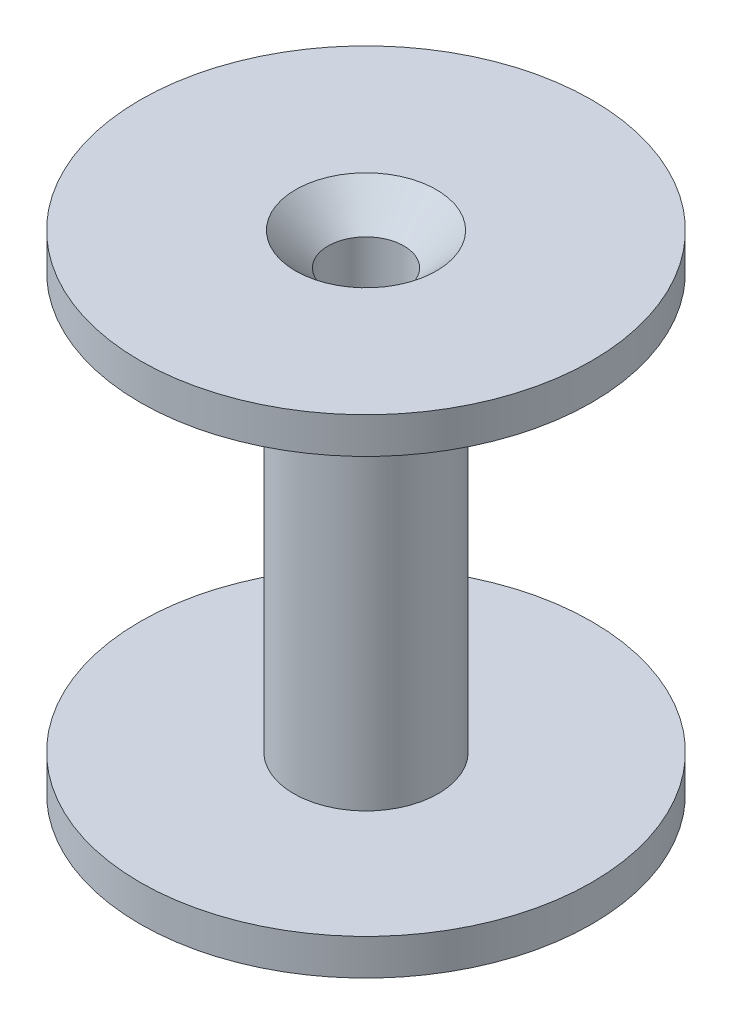
ISO-10303-21;
HEADER;
FILE_DESCRIPTION(('STEP AP214'),'2;1');
FILE_NAME('part.step','',(''),(''),'','','');
FILE_SCHEMA(('AUTOMOTIVE_DESIGN { 1 0 10303 214 1 1 1 1 }'));
ENDSEC;
DATA;
#1=APPLICATION_CONTEXT('core data for automotive mechanical design processes');
#2=APPLICATION_PROTOCOL_DEFINITION('international standard','automotive_design',2000,#1);
#3=PRODUCT_CONTEXT('',#1,'mechanical');
#4=PRODUCT('Part','Part','',(#3));
#5=PRODUCT_RELATED_PRODUCT_CATEGORY('part','',(#4));
#6=PRODUCT_DEFINITION_FORMATION('','',#4);
#7=PRODUCT_DEFINITION_CONTEXT('part definition',#1,'design');
#8=PRODUCT_DEFINITION('design','',#6,#7);
#9=PRODUCT_DEFINITION_SHAPE('','',#8);
#10=(LENGTH_UNIT() NAMED_UNIT(*) SI_UNIT(.MILLI.,.METRE.));
#11=(NAMED_UNIT(*) PLANE_ANGLE_UNIT() SI_UNIT($,.RADIAN.));
#12=(NAMED_UNIT(*) SI_UNIT($,.STERADIAN.) SOLID_ANGLE_UNIT());
#13=UNCERTAINTY_MEASURE_WITH_UNIT(LENGTH_MEASURE(1.E-05),#10,'distance_accuracy_value','');
#14=(GEOMETRIC_REPRESENTATION_CONTEXT(3) GLOBAL_UNCERTAINTY_ASSIGNED_CONTEXT((#13)) GLOBAL_UNIT_ASSIGNED_CONTEXT((#10,
#11,#12)) REPRESENTATION_CONTEXT('',''));
#15=CARTESIAN_POINT('',(0.,0.,0.));
#16=DIRECTION('',(0.,0.,1.));
#17=DIRECTION('',(1.,0.,0.));
#18=AXIS2_PLACEMENT_3D('',#15,#16,#17);
#19=CARTESIAN_POINT('',(0.,11.5,4.));
#20=DIRECTION('',(0.,-1.,0.));
#21=DIRECTION('',(0.,0.,-1.));
#22=AXIS2_PLACEMENT_3D('',#19,#20,#21);
#23=PLANE('',#22);
#24=CARTESIAN_POINT('',(0.,11.5,0.));
#25=DIRECTION('',(0.,1.,0.));
#26=DIRECTION('',(0.,0.,1.));
#27=AXIS2_PLACEMENT_3D('',#24,#25,#26);
#28=CIRCLE('',#27,4.);
#29=CARTESIAN_POINT('',(0.,11.5,4.));
#30=VERTEX_POINT('',#29);
#31=EDGE_CURVE('E61',#30,#30,#28,.T.);
#32=ORIENTED_EDGE('',*,*,#31,.T.);
#33=EDGE_LOOP('',(#32));
#34=FACE_BOUND('',#33,.T.);
#35=CARTESIAN_POINT('',(0.,11.5,0.));
#36=DIRECTION('',(0.,1.,0.));
#37=DIRECTION('',(0.,0.,1.));
#38=AXIS2_PLACEMENT_3D('',#35,#36,#37);
#39=CIRCLE('',#38,12.5);
#40=CARTESIAN_POINT('',(0.,11.5,12.5));
#41=VERTEX_POINT('',#40);
#42=EDGE_CURVE('E10',#41,#41,#39,.T.);
#43=ORIENTED_EDGE('',*,*,#42,.F.);
#44=EDGE_LOOP('',(#43));
#45=FACE_BOUND('',#44,.T.);
#46=ADVANCED_FACE('F30',(#34,#45),#23,.T.);
#47=CARTESIAN_POINT('',(0.,40.3783783783784,0.));
#48=DIRECTION('',(0.,1.,0.));
#49=DIRECTION('',(0.,0.,1.));
#50=AXIS2_PLACEMENT_3D('',#47,#48,#49);
#51=CYLINDRICAL_SURFACE('',#50,12.5);
#52=ORIENTED_EDGE('',*,*,#42,.T.);
#53=EDGE_LOOP('',(#52));
#54=FACE_BOUND('',#53,.T.);
#55=CARTESIAN_POINT('',(0.,13.5,0.));
#56=DIRECTION('',(0.,1.,0.));
#57=DIRECTION('',(0.,0.,1.));
#58=AXIS2_PLACEMENT_3D('',#55,#56,#57);
#59=CIRCLE('',#58,12.5);
#60=CARTESIAN_POINT('',(0.,13.5,12.5));
#61=VERTEX_POINT('',#60);
#62=EDGE_CURVE('E36',#61,#61,#59,.T.);
#63=ORIENTED_EDGE('',*,*,#62,.F.);
#64=EDGE_LOOP('',(#63));
#65=FACE_BOUND('',#64,.T.);
#66=ADVANCED_FACE('F79',(#54,#65),#51,.T.);
#67=CARTESIAN_POINT('',(0.,13.5,12.5));
#68=DIRECTION('',(0.,1.,0.));
#69=DIRECTION('',(0.,0.,1.));
#70=AXIS2_PLACEMENT_3D('',#67,#68,#69);
#71=PLANE('',#70);
#72=ORIENTED_EDGE('',*,*,#62,.T.);
#73=EDGE_LOOP('',(#72));
#74=FACE_BOUND('',#73,.T.);
#75=CARTESIAN_POINT('',(0.,13.5,0.));
#76=DIRECTION('',(0.,1.,0.));
#77=DIRECTION('',(0.,0.,1.));
#78=AXIS2_PLACEMENT_3D('',#75,#76,#77);
#79=CIRCLE('',#78,3.89813654053422);
#80=CARTESIAN_POINT('',(0.,13.5,3.89813654053422));
#81=VERTEX_POINT('',#80);
#82=EDGE_CURVE('E40',#81,#81,#79,.T.);
#83=ORIENTED_EDGE('',*,*,#82,.F.);
#84=EDGE_LOOP('',(#83));
#85=FACE_BOUND('',#84,.T.);
#86=ADVANCED_FACE('F83',(#74,#85),#71,.T.);
#87=CARTESIAN_POINT('',(0.,11.7018634594658,0.));
#88=DIRECTION('',(0.,1.,0.));
#89=DIRECTION('',(0.,0.,1.));
#90=AXIS2_PLACEMENT_3D('',#87,#88,#89);
#91=CONICAL_SURFACE('',#90,2.1,0.785398163397447);
#92=ORIENTED_EDGE('',*,*,#82,.T.);
#93=EDGE_LOOP('',(#92));
#94=FACE_BOUND('',#93,.T.);
#95=CARTESIAN_POINT('',(0.,11.7018634594658,0.));
#96=DIRECTION('',(0.,1.,0.));
#97=DIRECTION('',(0.,0.,1.));
#98=AXIS2_PLACEMENT_3D('',#95,#96,#97);
#99=CIRCLE('',#98,2.1);
#100=CARTESIAN_POINT('',(0.,11.7018634594658,2.1));
#101=VERTEX_POINT('',#100);
#102=EDGE_CURVE('E44',#101,#101,#99,.T.);
#103=ORIENTED_EDGE('',*,*,#102,.F.);
#104=EDGE_LOOP('',(#103));
#105=FACE_BOUND('',#104,.T.);
#106=ADVANCED_FACE('F87',(#94,#105),#91,.F.);
#107=CARTESIAN_POINT('',(0.,40.3783783783784,0.));
#108=DIRECTION('',(0.,1.,0.));
#109=DIRECTION('',(0.,0.,1.));
#110=AXIS2_PLACEMENT_3D('',#107,#108,#109);
#111=CYLINDRICAL_SURFACE('',#110,2.1);
#112=ORIENTED_EDGE('',*,*,#102,.T.);
#113=EDGE_LOOP('',(#112));
#114=FACE_BOUND('',#113,.T.);
#115=CARTESIAN_POINT('',(0.,-13.5,0.));
#116=DIRECTION('',(0.,1.,0.));
#117=DIRECTION('',(0.,0.,1.));
#118=AXIS2_PLACEMENT_3D('',#115,#116,#117);
#119=CIRCLE('',#118,2.09999999999999);
#120=CARTESIAN_POINT('',(0.,-13.5,2.09999999999999));
#121=VERTEX_POINT('',#120);
#122=EDGE_CURVE('E49',#121,#121,#119,.T.);
#123=ORIENTED_EDGE('',*,*,#122,.F.);
#124=EDGE_LOOP('',(#123));
#125=FACE_BOUND('',#124,.T.);
#126=ADVANCED_FACE('F93',(#114,#125),#111,.F.);
#127=CARTESIAN_POINT('',(0.,-13.5,12.5));
#128=DIRECTION('',(0.,-1.,0.));
#129=DIRECTION('',(0.,0.,-1.));
#130=AXIS2_PLACEMENT_3D('',#127,#128,#129);
#131=PLANE('',#130);
#132=ORIENTED_EDGE('',*,*,#122,.T.);
#133=EDGE_LOOP('',(#132));
#134=FACE_BOUND('',#133,.T.);
#135=CARTESIAN_POINT('',(0.,-13.5,0.));
#136=DIRECTION('',(0.,1.,0.));
#137=DIRECTION('',(0.,0.,1.));
#138=AXIS2_PLACEMENT_3D('',#135,#136,#137);
#139=CIRCLE('',#138,12.5);
#140=CARTESIAN_POINT('',(0.,-13.5,12.5));
#141=VERTEX_POINT('',#140);
#142=EDGE_CURVE('E52',#141,#141,#139,.T.);
#143=ORIENTED_EDGE('',*,*,#142,.F.);
#144=EDGE_LOOP('',(#143));
#145=FACE_BOUND('',#144,.T.);
#146=ADVANCED_FACE('F97',(#134,#145),#131,.T.);
#147=CARTESIAN_POINT('',(0.,40.3783783783784,0.));
#148=DIRECTION('',(0.,1.,0.));
#149=DIRECTION('',(0.,0.,1.));
#150=AXIS2_PLACEMENT_3D('',#147,#148,#149);
#151=CYLINDRICAL_SURFACE('',#150,12.5);
#152=ORIENTED_EDGE('',*,*,#142,.T.);
#153=EDGE_LOOP('',(#152));
#154=FACE_BOUND('',#153,.T.);
#155=CARTESIAN_POINT('',(0.,-11.5,0.));
#156=DIRECTION('',(0.,1.,0.));
#157=DIRECTION('',(0.,0.,1.));
#158=AXIS2_PLACEMENT_3D('',#155,#156,#157);
#159=CIRCLE('',#158,12.5);
#160=CARTESIAN_POINT('',(0.,-11.5,12.5));
#161=VERTEX_POINT('',#160);
#162=EDGE_CURVE('E55',#161,#161,#159,.T.);
#163=ORIENTED_EDGE('',*,*,#162,.F.);
#164=EDGE_LOOP('',(#163));
#165=FACE_BOUND('',#164,.T.);
#166=ADVANCED_FACE('F75',(#154,#165),#151,.T.);
#167=CARTESIAN_POINT('',(0.,-11.5,3.99999999999999));
#168=DIRECTION('',(0.,1.,0.));
#169=DIRECTION('',(0.,0.,1.));
#170=AXIS2_PLACEMENT_3D('',#167,#168,#169);
#171=PLANE('',#170);
#172=ORIENTED_EDGE('',*,*,#162,.T.);
#173=EDGE_LOOP('',(#172));
#174=FACE_BOUND('',#173,.T.);
#175=CARTESIAN_POINT('',(0.,-11.5,0.));
#176=DIRECTION('',(0.,1.,0.));
#177=DIRECTION('',(0.,0.,1.));
#178=AXIS2_PLACEMENT_3D('',#175,#176,#177);
#179=CIRCLE('',#178,3.99999999999999);
#180=CARTESIAN_POINT('',(0.,-11.5,3.99999999999999));
#181=VERTEX_POINT('',#180);
#182=EDGE_CURVE('E58',#181,#181,#179,.T.);
#183=ORIENTED_EDGE('',*,*,#182,.F.);
#184=EDGE_LOOP('',(#183));
#185=FACE_BOUND('',#184,.T.);
#186=ADVANCED_FACE('F69',(#174,#185),#171,.T.);
#187=CARTESIAN_POINT('',(0.,40.3783783783784,0.));
#188=DIRECTION('',(0.,1.,0.));
#189=DIRECTION('',(0.,0.,1.));
#190=AXIS2_PLACEMENT_3D('',#187,#188,#189);
#191=CYLINDRICAL_SURFACE('',#190,3.99999999999999);
#192=ORIENTED_EDGE('',*,*,#182,.T.);
#193=EDGE_LOOP('',(#192));
#194=FACE_BOUND('',#193,.T.);
#195=ORIENTED_EDGE('',*,*,#31,.F.);
#196=EDGE_LOOP('',(#195));
#197=FACE_BOUND('',#196,.T.);
#198=ADVANCED_FACE('F67',(#194,#197),#191,.T.);
#199=CLOSED_SHELL('',(#46,#66,#86,#106,#126,#146,#166,#186,#198));
#200=MANIFOLD_SOLID_BREP('B2',#199);
#201=ADVANCED_BREP_SHAPE_REPRESENTATION('',(#18,#200),#14);
#202=SHAPE_DEFINITION_REPRESENTATION(#9,#201);
ENDSEC;
END-ISO-10303-21;
